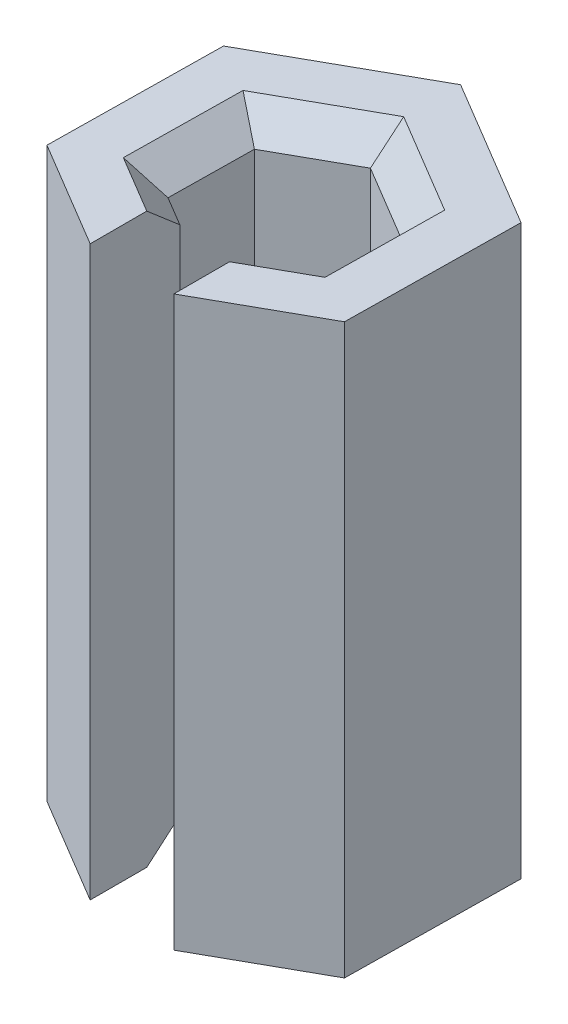
ISO-10303-21;
HEADER;
FILE_DESCRIPTION(('STEP AP214'),'2;1');
FILE_NAME('part.step','',(''),(''),'','','');
FILE_SCHEMA(('AUTOMOTIVE_DESIGN { 1 0 10303 214 1 1 1 1 }'));
ENDSEC;
DATA;
#1=APPLICATION_CONTEXT('core data for automotive mechanical design processes');
#2=APPLICATION_PROTOCOL_DEFINITION('international standard','automotive_design',2000,#1);
#3=PRODUCT_CONTEXT('',#1,'mechanical');
#4=PRODUCT('Part','Part','',(#3));
#5=PRODUCT_RELATED_PRODUCT_CATEGORY('part','',(#4));
#6=PRODUCT_DEFINITION_FORMATION('','',#4);
#7=PRODUCT_DEFINITION_CONTEXT('part definition',#1,'design');
#8=PRODUCT_DEFINITION('design','',#6,#7);
#9=PRODUCT_DEFINITION_SHAPE('','',#8);
#10=(LENGTH_UNIT() NAMED_UNIT(*) SI_UNIT(.MILLI.,.METRE.));
#11=(NAMED_UNIT(*) PLANE_ANGLE_UNIT() SI_UNIT($,.RADIAN.));
#12=(NAMED_UNIT(*) SI_UNIT($,.STERADIAN.) SOLID_ANGLE_UNIT());
#13=UNCERTAINTY_MEASURE_WITH_UNIT(LENGTH_MEASURE(1.E-05),#10,'distance_accuracy_value','');
#14=(GEOMETRIC_REPRESENTATION_CONTEXT(3) GLOBAL_UNCERTAINTY_ASSIGNED_CONTEXT((#13)) GLOBAL_UNIT_ASSIGNED_CONTEXT((#10,
#11,#12)) REPRESENTATION_CONTEXT('',''));
#15=CARTESIAN_POINT('',(0.,0.,0.));
#16=DIRECTION('',(0.,0.,1.));
#17=DIRECTION('',(1.,0.,0.));
#18=AXIS2_PLACEMENT_3D('',#15,#16,#17);
#19=CARTESIAN_POINT('',(0.,20.,0.));
#20=DIRECTION('',(0.,1.,0.));
#21=DIRECTION('',(0.,0.,1.));
#22=AXIS2_PLACEMENT_3D('',#19,#20,#21);
#23=PLANE('',#22);
#24=DIRECTION('',(0.,0.,1.));
#25=VECTOR('',#24,1.);
#26=CARTESIAN_POINT('',(-1.58490770605281,20.,1.65700419467966));
#27=LINE('',#26,#25);
#28=CARTESIAN_POINT('',(-1.58490770605281,20.,3.2440418816604));
#29=VERTEX_POINT('',#28);
#30=CARTESIAN_POINT('',(-1.58490770605281,20.,5.23604892409862));
#31=VERTEX_POINT('',#30);
#32=EDGE_CURVE('E201',#29,#31,#27,.T.);
#33=ORIENTED_EDGE('',*,*,#32,.F.);
#34=DIRECTION('',(-0.85901741654641,0.,-0.511946362493116));
#35=VECTOR('',#34,1.);
#36=CARTESIAN_POINT('',(-1.84202202837534,20.,3.09081013161382));
#37=LINE('',#36,#35);
#38=CARTESIAN_POINT('',(-3.6265020898766,20.,2.0273182176781));
#39=VERTEX_POINT('',#38);
#40=EDGE_CURVE('E257',#29,#39,#37,.T.);
#41=ORIENTED_EDGE('',*,*,#40,.T.);
#42=DIRECTION('',(0.0138498470208704,0.,-0.999904086269027));
#43=VECTOR('',#42,1.);
#44=CARTESIAN_POINT('',(-3.59773110643956,20.,-0.0498328050966762));
#45=LINE('',#44,#43);
#46=CARTESIAN_POINT('',(-3.56896012300252,20.,-2.12698382787145));
#47=VERTEX_POINT('',#46);
#48=EDGE_CURVE('E259',#39,#47,#45,.T.);
#49=ORIENTED_EDGE('',*,*,#48,.T.);
#50=DIRECTION('',(0.87286726356728,0.,-0.487957723775912));
#51=VECTOR('',#50,1.);
#52=CARTESIAN_POINT('',(-1.75570907806422,20.,-3.1406429367105));
#53=LINE('',#52,#51);
#54=CARTESIAN_POINT('',(0.0575419668740808,20.,-4.15430204554954));
#55=VERTEX_POINT('',#54);
#56=EDGE_CURVE('E250',#47,#55,#53,.T.);
#57=ORIENTED_EDGE('',*,*,#56,.T.);
#58=DIRECTION('',(0.859017416546409,0.,0.511946362493116));
#59=VECTOR('',#58,1.);
#60=CARTESIAN_POINT('',(1.84202202837534,20.,-3.09081013161382));
#61=LINE('',#60,#59);
#62=CARTESIAN_POINT('',(3.6265020898766,20.,-2.02731821767809));
#63=VERTEX_POINT('',#62);
#64=EDGE_CURVE('E252',#55,#63,#61,.T.);
#65=ORIENTED_EDGE('',*,*,#64,.T.);
#66=DIRECTION('',(-0.0138498470208705,0.,0.999904086269027));
#67=VECTOR('',#66,1.);
#68=CARTESIAN_POINT('',(3.59773110643956,20.,0.0498328050966768));
#69=LINE('',#68,#67);
#70=CARTESIAN_POINT('',(3.56896012300252,20.,2.12698382787145));
#71=VERTEX_POINT('',#70);
#72=EDGE_CURVE('E254',#63,#71,#69,.T.);
#73=ORIENTED_EDGE('',*,*,#72,.T.);
#74=DIRECTION('',(-0.87286726356728,0.,0.487957723775912));
#75=VECTOR('',#74,1.);
#76=CARTESIAN_POINT('',(1.75570907806422,20.,3.1406429367105));
#77=LINE('',#76,#75);
#78=CARTESIAN_POINT('',(1.41509229394719,20.,3.33105744484356));
#79=VERTEX_POINT('',#78);
#80=EDGE_CURVE('E200',#71,#79,#77,.T.);
#81=ORIENTED_EDGE('',*,*,#80,.T.);
#82=DIRECTION('',(0.,0.,-1.));
#83=VECTOR('',#82,1.);
#84=CARTESIAN_POINT('',(1.41509229394719,20.,1.65700419467966));
#85=LINE('',#84,#83);
#86=CARTESIAN_POINT('',(1.41509229394719,20.,5.29145716970463));
#87=VERTEX_POINT('',#86);
#88=EDGE_CURVE('E184',#87,#79,#85,.T.);
#89=ORIENTED_EDGE('',*,*,#88,.F.);
#90=DIRECTION('',(0.87286726356728,0.,-0.487957723775912));
#91=VECTOR('',#90,1.);
#92=CARTESIAN_POINT('',(-0.0849077060528104,20.,6.12999999999998));
#93=LINE('',#92,#91);
#94=CARTESIAN_POINT('',(5.26628187217219,20.,3.13853223041879));
#95=VERTEX_POINT('',#94);
#96=EDGE_CURVE('E197',#87,#95,#93,.T.);
#97=ORIENTED_EDGE('',*,*,#96,.T.);
#98=DIRECTION('',(0.0138498470208701,0.,-0.999904086269027));
#99=VECTOR('',#98,1.);
#100=CARTESIAN_POINT('',(5.26628187217219,20.,3.13853223041879));
#101=LINE('',#100,#99);
#102=CARTESIAN_POINT('',(5.351189578225,20.,-2.99146776958119));
#103=VERTEX_POINT('',#102);
#104=EDGE_CURVE('E207',#95,#103,#101,.T.);
#105=ORIENTED_EDGE('',*,*,#104,.T.);
#106=DIRECTION('',(-0.859017416546409,0.,-0.511946362493116));
#107=VECTOR('',#106,1.);
#108=CARTESIAN_POINT('',(5.351189578225,20.,-2.99146776958119));
#109=LINE('',#108,#107);
#110=CARTESIAN_POINT('',(0.0849077060528081,20.,-6.12999999999998));
#111=VERTEX_POINT('',#110);
#112=EDGE_CURVE('E232',#103,#111,#109,.T.);
#113=ORIENTED_EDGE('',*,*,#112,.T.);
#114=DIRECTION('',(-0.87286726356728,0.,0.487957723775912));
#115=VECTOR('',#114,1.);
#116=CARTESIAN_POINT('',(0.0849077060528081,20.,-6.12999999999998));
#117=LINE('',#116,#115);
#118=CARTESIAN_POINT('',(-5.26628187217219,20.,-3.13853223041879));
#119=VERTEX_POINT('',#118);
#120=EDGE_CURVE('E388',#111,#119,#117,.T.);
#121=ORIENTED_EDGE('',*,*,#120,.T.);
#122=DIRECTION('',(-0.0138498470208703,0.,0.999904086269027));
#123=VECTOR('',#122,1.);
#124=CARTESIAN_POINT('',(-5.26628187217219,20.,-3.13853223041879));
#125=LINE('',#124,#123);
#126=CARTESIAN_POINT('',(-5.351189578225,20.,2.9914677695812));
#127=VERTEX_POINT('',#126);
#128=EDGE_CURVE('E213',#119,#127,#125,.T.);
#129=ORIENTED_EDGE('',*,*,#128,.T.);
#130=DIRECTION('',(0.85901741654641,0.,0.511946362493116));
#131=VECTOR('',#130,1.);
#132=CARTESIAN_POINT('',(-5.351189578225,20.,2.9914677695812));
#133=LINE('',#132,#131);
#134=EDGE_CURVE('E208',#127,#31,#133,.T.);
#135=ORIENTED_EDGE('',*,*,#134,.T.);
#136=EDGE_LOOP('',(#33,#41,#49,#57,#65,#73,#81,#89,#97,#105,#113,#121,#129,#135));
#137=FACE_BOUND('',#136,.T.);
#138=ADVANCED_FACE('F40',(#137),#23,.T.);
#139=CARTESIAN_POINT('',(0.,0.,0.));
#140=DIRECTION('',(0.,1.,0.));
#141=DIRECTION('',(0.,0.,1.));
#142=AXIS2_PLACEMENT_3D('',#139,#140,#141);
#143=PLANE('',#142);
#144=DIRECTION('',(0.85901741654641,0.,0.511946362493116));
#145=VECTOR('',#144,1.);
#146=CARTESIAN_POINT('',(-0.553495903555727,0.,3.85872967535349));
#147=LINE('',#146,#145);
#148=CARTESIAN_POINT('',(-3.6265020898766,0.,2.0273182176781));
#149=VERTEX_POINT('',#148);
#150=CARTESIAN_POINT('',(-1.58490770605281,0.,3.2440418816604));
#151=VERTEX_POINT('',#150);
#152=EDGE_CURVE('E289',#149,#151,#147,.T.);
#153=ORIENTED_EDGE('',*,*,#152,.T.);
#154=DIRECTION('',(0.,0.,1.));
#155=VECTOR('',#154,1.);
#156=CARTESIAN_POINT('',(-1.58490770605281,0.,0.));
#157=LINE('',#156,#155);
#158=CARTESIAN_POINT('',(-1.58490770605281,0.,5.23604892409862));
#159=VERTEX_POINT('',#158);
#160=EDGE_CURVE('E55',#151,#159,#157,.T.);
#161=ORIENTED_EDGE('',*,*,#160,.T.);
#162=DIRECTION('',(0.85901741654641,0.,0.511946362493116));
#163=VECTOR('',#162,1.);
#164=CARTESIAN_POINT('',(-5.351189578225,0.,2.9914677695812));
#165=LINE('',#164,#163);
#166=CARTESIAN_POINT('',(-5.351189578225,0.,2.9914677695812));
#167=VERTEX_POINT('',#166);
#168=EDGE_CURVE('E225',#167,#159,#165,.T.);
#169=ORIENTED_EDGE('',*,*,#168,.F.);
#170=DIRECTION('',(-0.0138498470208703,0.,0.999904086269027));
#171=VECTOR('',#170,1.);
#172=CARTESIAN_POINT('',(-5.26628187217219,0.,-3.13853223041879));
#173=LINE('',#172,#171);
#174=CARTESIAN_POINT('',(-5.26628187217219,0.,-3.13853223041879));
#175=VERTEX_POINT('',#174);
#176=EDGE_CURVE('E223',#175,#167,#173,.T.);
#177=ORIENTED_EDGE('',*,*,#176,.F.);
#178=DIRECTION('',(-0.87286726356728,0.,0.487957723775912));
#179=VECTOR('',#178,1.);
#180=CARTESIAN_POINT('',(0.0849077060528081,0.,-6.12999999999998));
#181=LINE('',#180,#179);
#182=CARTESIAN_POINT('',(0.0849077060528081,0.,-6.12999999999998));
#183=VERTEX_POINT('',#182);
#184=EDGE_CURVE('E220',#183,#175,#181,.T.);
#185=ORIENTED_EDGE('',*,*,#184,.F.);
#186=DIRECTION('',(-0.859017416546409,0.,-0.511946362493116));
#187=VECTOR('',#186,1.);
#188=CARTESIAN_POINT('',(5.351189578225,0.,-2.99146776958119));
#189=LINE('',#188,#187);
#190=CARTESIAN_POINT('',(5.351189578225,0.,-2.99146776958119));
#191=VERTEX_POINT('',#190);
#192=EDGE_CURVE('E217',#191,#183,#189,.T.);
#193=ORIENTED_EDGE('',*,*,#192,.F.);
#194=DIRECTION('',(0.0138498470208701,0.,-0.999904086269027));
#195=VECTOR('',#194,1.);
#196=CARTESIAN_POINT('',(5.26628187217219,0.,3.13853223041879));
#197=LINE('',#196,#195);
#198=CARTESIAN_POINT('',(5.26628187217219,0.,3.13853223041879));
#199=VERTEX_POINT('',#198);
#200=EDGE_CURVE('E230',#199,#191,#197,.T.);
#201=ORIENTED_EDGE('',*,*,#200,.F.);
#202=DIRECTION('',(0.87286726356728,0.,-0.487957723775912));
#203=VECTOR('',#202,1.);
#204=CARTESIAN_POINT('',(-0.0849077060528104,0.,6.12999999999998));
#205=LINE('',#204,#203);
#206=CARTESIAN_POINT('',(1.41509229394719,0.,5.29145716970463));
#207=VERTEX_POINT('',#206);
#208=EDGE_CURVE('E228',#207,#199,#205,.T.);
#209=ORIENTED_EDGE('',*,*,#208,.F.);
#210=DIRECTION('',(0.,0.,-1.));
#211=VECTOR('',#210,1.);
#212=CARTESIAN_POINT('',(1.41509229394719,0.,0.));
#213=LINE('',#212,#211);
#214=CARTESIAN_POINT('',(1.41509229394719,0.,3.33105744484356));
#215=VERTEX_POINT('',#214);
#216=EDGE_CURVE('E187',#207,#215,#213,.T.);
#217=ORIENTED_EDGE('',*,*,#216,.T.);
#218=DIRECTION('',(0.87286726356728,0.,-0.487957723775912));
#219=VECTOR('',#218,1.);
#220=CARTESIAN_POINT('',(3.06500997341514,0.,2.40870635104663));
#221=LINE('',#220,#219);
#222=CARTESIAN_POINT('',(3.56896012300252,0.,2.12698382787145));
#223=VERTEX_POINT('',#222);
#224=EDGE_CURVE('E287',#215,#223,#221,.T.);
#225=ORIENTED_EDGE('',*,*,#224,.T.);
#226=DIRECTION('',(0.0138498470208705,0.,-0.999904086269027));
#227=VECTOR('',#226,1.);
#228=CARTESIAN_POINT('',(3.61850587697087,0.,-1.45002332430686));
#229=LINE('',#228,#227);
#230=CARTESIAN_POINT('',(3.6265020898766,0.,-2.02731821767809));
#231=VERTEX_POINT('',#230);
#232=EDGE_CURVE('E285',#223,#231,#229,.T.);
#233=ORIENTED_EDGE('',*,*,#232,.T.);
#234=DIRECTION('',(-0.859017416546409,0.,-0.511946362493116));
#235=VECTOR('',#234,1.);
#236=CARTESIAN_POINT('',(0.553495903555729,0.,-3.85872967535349));
#237=LINE('',#236,#235);
#238=CARTESIAN_POINT('',(0.0575419668740807,0.,-4.15430204554954));
#239=VERTEX_POINT('',#238);
#240=EDGE_CURVE('E296',#231,#239,#237,.T.);
#241=ORIENTED_EDGE('',*,*,#240,.T.);
#242=DIRECTION('',(-0.87286726356728,0.,0.487957723775912));
#243=VECTOR('',#242,1.);
#244=CARTESIAN_POINT('',(-3.06500997341514,0.,-2.40870635104663));
#245=LINE('',#244,#243);
#246=CARTESIAN_POINT('',(-3.56896012300252,0.,-2.12698382787145));
#247=VERTEX_POINT('',#246);
#248=EDGE_CURVE('E294',#239,#247,#245,.T.);
#249=ORIENTED_EDGE('',*,*,#248,.T.);
#250=DIRECTION('',(-0.0138498470208704,0.,0.999904086269027));
#251=VECTOR('',#250,1.);
#252=CARTESIAN_POINT('',(-3.61850587697087,0.,1.45002332430686));
#253=LINE('',#252,#251);
#254=EDGE_CURVE('E292',#247,#149,#253,.T.);
#255=ORIENTED_EDGE('',*,*,#254,.T.);
#256=EDGE_LOOP('',(#153,#161,#169,#177,#185,#193,#201,#209,#217,#225,#233,#241,#249,#255));
#257=FACE_BOUND('',#256,.T.);
#258=ADVANCED_FACE('F330',(#257),#143,.F.);
#259=CARTESIAN_POINT('',(5.351189578225,20.,-2.99146776958119));
#260=DIRECTION('',(-0.511946362493116,0.,0.85901741654641));
#261=DIRECTION('',(0.85901741654641,0.,0.511946362493116));
#262=AXIS2_PLACEMENT_3D('',#259,#260,#261);
#263=PLANE('',#262);
#264=ORIENTED_EDGE('',*,*,#192,.T.);
#265=DIRECTION('',(0.,-1.,0.));
#266=VECTOR('',#265,1.);
#267=CARTESIAN_POINT('',(0.0849077060528081,20.,-6.12999999999998));
#268=LINE('',#267,#266);
#269=EDGE_CURVE('E242',#111,#183,#268,.T.);
#270=ORIENTED_EDGE('',*,*,#269,.F.);
#271=ORIENTED_EDGE('',*,*,#112,.F.);
#272=DIRECTION('',(0.,-1.,0.));
#273=VECTOR('',#272,1.);
#274=CARTESIAN_POINT('',(5.351189578225,20.,-2.99146776958119));
#275=LINE('',#274,#273);
#276=EDGE_CURVE('E210',#103,#191,#275,.T.);
#277=ORIENTED_EDGE('',*,*,#276,.T.);
#278=EDGE_LOOP('',(#264,#270,#271,#277));
#279=FACE_BOUND('',#278,.T.);
#280=ADVANCED_FACE('F405',(#279),#263,.F.);
#281=CARTESIAN_POINT('',(0.0849077060528081,20.,-6.12999999999998));
#282=DIRECTION('',(0.487957723775912,0.,0.87286726356728));
#283=DIRECTION('',(0.87286726356728,0.,-0.487957723775912));
#284=AXIS2_PLACEMENT_3D('',#281,#282,#283);
#285=PLANE('',#284);
#286=ORIENTED_EDGE('',*,*,#184,.T.);
#287=DIRECTION('',(0.,-1.,0.));
#288=VECTOR('',#287,1.);
#289=CARTESIAN_POINT('',(-5.26628187217219,20.,-3.13853223041879));
#290=LINE('',#289,#288);
#291=EDGE_CURVE('E239',#119,#175,#290,.T.);
#292=ORIENTED_EDGE('',*,*,#291,.F.);
#293=ORIENTED_EDGE('',*,*,#120,.F.);
#294=ORIENTED_EDGE('',*,*,#269,.T.);
#295=EDGE_LOOP('',(#286,#292,#293,#294));
#296=FACE_BOUND('',#295,.T.);
#297=ADVANCED_FACE('F402',(#296),#285,.F.);
#298=CARTESIAN_POINT('',(-5.26628187217219,20.,-3.13853223041879));
#299=DIRECTION('',(0.999904086269027,0.,0.0138498470208703));
#300=DIRECTION('',(0.0138498470208703,0.,-0.999904086269027));
#301=AXIS2_PLACEMENT_3D('',#298,#299,#300);
#302=PLANE('',#301);
#303=ORIENTED_EDGE('',*,*,#176,.T.);
#304=DIRECTION('',(0.,-1.,0.));
#305=VECTOR('',#304,1.);
#306=CARTESIAN_POINT('',(-5.351189578225,20.,2.9914677695812));
#307=LINE('',#306,#305);
#308=EDGE_CURVE('E236',#127,#167,#307,.T.);
#309=ORIENTED_EDGE('',*,*,#308,.F.);
#310=ORIENTED_EDGE('',*,*,#128,.F.);
#311=ORIENTED_EDGE('',*,*,#291,.T.);
#312=EDGE_LOOP('',(#303,#309,#310,#311));
#313=FACE_BOUND('',#312,.T.);
#314=ADVANCED_FACE('F394',(#313),#302,.F.);
#315=CARTESIAN_POINT('',(-5.351189578225,20.,2.9914677695812));
#316=DIRECTION('',(0.511946362493116,0.,-0.85901741654641));
#317=DIRECTION('',(-0.85901741654641,0.,-0.511946362493116));
#318=AXIS2_PLACEMENT_3D('',#315,#316,#317);
#319=PLANE('',#318);
#320=ORIENTED_EDGE('',*,*,#168,.T.);
#321=DIRECTION('',(0.,1.,0.));
#322=VECTOR('',#321,1.);
#323=CARTESIAN_POINT('',(-1.58490770605281,20.,5.23604892409862));
#324=LINE('',#323,#322);
#325=EDGE_CURVE('E317',#159,#31,#324,.T.);
#326=ORIENTED_EDGE('',*,*,#325,.T.);
#327=ORIENTED_EDGE('',*,*,#134,.F.);
#328=ORIENTED_EDGE('',*,*,#308,.T.);
#329=EDGE_LOOP('',(#320,#326,#327,#328));
#330=FACE_BOUND('',#329,.T.);
#331=ADVANCED_FACE('F398',(#330),#319,.F.);
#332=CARTESIAN_POINT('',(-0.0849077060528104,20.,6.12999999999998));
#333=DIRECTION('',(-0.487957723775912,0.,-0.87286726356728));
#334=DIRECTION('',(-0.87286726356728,0.,0.487957723775912));
#335=AXIS2_PLACEMENT_3D('',#332,#333,#334);
#336=PLANE('',#335);
#337=ORIENTED_EDGE('',*,*,#96,.F.);
#338=DIRECTION('',(0.,-1.,0.));
#339=VECTOR('',#338,1.);
#340=CARTESIAN_POINT('',(1.41509229394719,20.,5.29145716970463));
#341=LINE('',#340,#339);
#342=EDGE_CURVE('E181',#87,#207,#341,.T.);
#343=ORIENTED_EDGE('',*,*,#342,.T.);
#344=ORIENTED_EDGE('',*,*,#208,.T.);
#345=DIRECTION('',(0.,-1.,0.));
#346=VECTOR('',#345,1.);
#347=CARTESIAN_POINT('',(5.26628187217219,20.,3.13853223041879));
#348=LINE('',#347,#346);
#349=EDGE_CURVE('E205',#95,#199,#348,.T.);
#350=ORIENTED_EDGE('',*,*,#349,.F.);
#351=EDGE_LOOP('',(#337,#343,#344,#350));
#352=FACE_BOUND('',#351,.T.);
#353=ADVANCED_FACE('F203',(#352),#336,.F.);
#354=CARTESIAN_POINT('',(5.26628187217219,20.,3.13853223041879));
#355=DIRECTION('',(-0.999904086269027,0.,-0.0138498470208701));
#356=DIRECTION('',(-0.0138498470208701,0.,0.999904086269027));
#357=AXIS2_PLACEMENT_3D('',#354,#355,#356);
#358=PLANE('',#357);
#359=ORIENTED_EDGE('',*,*,#200,.T.);
#360=ORIENTED_EDGE('',*,*,#276,.F.);
#361=ORIENTED_EDGE('',*,*,#104,.F.);
#362=ORIENTED_EDGE('',*,*,#349,.T.);
#363=EDGE_LOOP('',(#359,#360,#361,#362));
#364=FACE_BOUND('',#363,.T.);
#365=ADVANCED_FACE('F408',(#364),#358,.F.);
#366=CARTESIAN_POINT('',(2.61860179070184,20.,-1.46387317132773));
#367=DIRECTION('',(-0.511946362493116,0.,0.859017416546409));
#368=DIRECTION('',(0.859017416546409,0.,0.511946362493116));
#369=AXIS2_PLACEMENT_3D('',#366,#367,#368);
#370=PLANE('',#369);
#371=DIRECTION('',(0.,-1.,0.));
#372=VECTOR('',#371,1.);
#373=CARTESIAN_POINT('',(2.61860179070184,20.,-1.46387317132773));
#374=LINE('',#373,#372);
#375=CARTESIAN_POINT('',(2.61860179070184,19.,-1.46387317132773));
#376=VERTEX_POINT('',#375);
#377=CARTESIAN_POINT('',(2.61860179070184,1.00000000000001,-1.46387317132773));
#378=VERTEX_POINT('',#377);
#379=EDGE_CURVE('E313',#376,#378,#374,.T.);
#380=ORIENTED_EDGE('',*,*,#379,.F.);
#381=DIRECTION('',(-0.859017416546409,0.,-0.511946362493116));
#382=VECTOR('',#381,1.);
#383=CARTESIAN_POINT('',(2.61860179070184,19.,-1.46387317132773));
#384=LINE('',#383,#382);
#385=CARTESIAN_POINT('',(0.0415495410626116,19.,-2.99971225880708));
#386=VERTEX_POINT('',#385);
#387=EDGE_CURVE('E279',#376,#386,#384,.T.);
#388=ORIENTED_EDGE('',*,*,#387,.T.);
#389=DIRECTION('',(0.,-1.,0.));
#390=VECTOR('',#389,1.);
#391=CARTESIAN_POINT('',(0.0415495410626116,20.,-2.99971225880708));
#392=LINE('',#391,#390);
#393=CARTESIAN_POINT('',(0.0415495410626116,1.00000000000001,-2.99971225880708));
#394=VERTEX_POINT('',#393);
#395=EDGE_CURVE('E221',#386,#394,#392,.T.);
#396=ORIENTED_EDGE('',*,*,#395,.T.);
#397=DIRECTION('',(0.859017416546409,0.,0.511946362493116));
#398=VECTOR('',#397,1.);
#399=CARTESIAN_POINT('',(2.61860179070184,1.00000000000001,-1.46387317132773));
#400=LINE('',#399,#398);
#401=EDGE_CURVE('E276',#394,#378,#400,.T.);
#402=ORIENTED_EDGE('',*,*,#401,.T.);
#403=EDGE_LOOP('',(#380,#388,#396,#402));
#404=FACE_BOUND('',#403,.T.);
#405=ADVANCED_FACE('F410',(#404),#370,.T.);
#406=CARTESIAN_POINT('',(0.0415495410626116,20.,-2.99971225880708));
#407=DIRECTION('',(0.487957723775912,0.,0.87286726356728));
#408=DIRECTION('',(0.87286726356728,0.,-0.487957723775912));
#409=AXIS2_PLACEMENT_3D('',#406,#407,#408);
#410=PLANE('',#409);
#411=ORIENTED_EDGE('',*,*,#395,.F.);
#412=DIRECTION('',(-0.87286726356728,0.,0.487957723775912));
#413=VECTOR('',#412,1.);
#414=CARTESIAN_POINT('',(0.0415495410626116,19.,-2.99971225880708));
#415=LINE('',#414,#413);
#416=CARTESIAN_POINT('',(-2.57705224963923,19.,-1.53583908747935));
#417=VERTEX_POINT('',#416);
#418=EDGE_CURVE('E283',#386,#417,#415,.T.);
#419=ORIENTED_EDGE('',*,*,#418,.T.);
#420=DIRECTION('',(0.,-1.,0.));
#421=VECTOR('',#420,1.);
#422=CARTESIAN_POINT('',(-2.57705224963923,20.,-1.53583908747935));
#423=LINE('',#422,#421);
#424=CARTESIAN_POINT('',(-2.57705224963923,1.00000000000001,-1.53583908747935));
#425=VERTEX_POINT('',#424);
#426=EDGE_CURVE('E381',#417,#425,#423,.T.);
#427=ORIENTED_EDGE('',*,*,#426,.T.);
#428=DIRECTION('',(0.87286726356728,0.,-0.487957723775912));
#429=VECTOR('',#428,1.);
#430=CARTESIAN_POINT('',(0.0415495410626116,1.00000000000001,-2.99971225880708));
#431=LINE('',#430,#429);
#432=EDGE_CURVE('E281',#425,#394,#431,.T.);
#433=ORIENTED_EDGE('',*,*,#432,.T.);
#434=EDGE_LOOP('',(#411,#419,#427,#433));
#435=FACE_BOUND('',#434,.T.);
#436=ADVANCED_FACE('F416',(#435),#410,.T.);
#437=CARTESIAN_POINT('',(-2.57705224963923,20.,-1.53583908747935));
#438=DIRECTION('',(0.999904086269027,0.,0.0138498470208703));
#439=DIRECTION('',(0.0138498470208703,0.,-0.999904086269027));
#440=AXIS2_PLACEMENT_3D('',#437,#438,#439);
#441=PLANE('',#440);
#442=ORIENTED_EDGE('',*,*,#426,.F.);
#443=DIRECTION('',(-0.0138498470208703,0.,0.999904086269027));
#444=VECTOR('',#443,1.);
#445=CARTESIAN_POINT('',(-2.57705224963923,19.,-1.53583908747935));
#446=LINE('',#445,#444);
#447=CARTESIAN_POINT('',(-2.61860179070184,19.,1.46387317132773));
#448=VERTEX_POINT('',#447);
#449=EDGE_CURVE('E247',#417,#448,#446,.T.);
#450=ORIENTED_EDGE('',*,*,#449,.T.);
#451=DIRECTION('',(0.,-1.,0.));
#452=VECTOR('',#451,1.);
#453=CARTESIAN_POINT('',(-2.61860179070184,20.,1.46387317132773));
#454=LINE('',#453,#452);
#455=CARTESIAN_POINT('',(-2.61860179070184,1.00000000000001,1.46387317132773));
#456=VERTEX_POINT('',#455);
#457=EDGE_CURVE('E379',#448,#456,#454,.T.);
#458=ORIENTED_EDGE('',*,*,#457,.T.);
#459=DIRECTION('',(0.0138498470208703,0.,-0.999904086269027));
#460=VECTOR('',#459,1.);
#461=CARTESIAN_POINT('',(-2.57705224963923,1.00000000000001,-1.53583908747935));
#462=LINE('',#461,#460);
#463=EDGE_CURVE('E245',#456,#425,#462,.T.);
#464=ORIENTED_EDGE('',*,*,#463,.T.);
#465=EDGE_LOOP('',(#442,#450,#458,#464));
#466=FACE_BOUND('',#465,.T.);
#467=ADVANCED_FACE('F431',(#466),#441,.T.);
#468=CARTESIAN_POINT('',(-2.61860179070184,20.,1.46387317132773));
#469=DIRECTION('',(0.511946362493116,0.,-0.85901741654641));
#470=DIRECTION('',(-0.85901741654641,0.,-0.511946362493116));
#471=AXIS2_PLACEMENT_3D('',#468,#469,#470);
#472=PLANE('',#471);
#473=DIRECTION('',(0.,1.,0.));
#474=VECTOR('',#473,1.);
#475=CARTESIAN_POINT('',(-1.58490770605281,20.,2.07992113074432));
#476=LINE('',#475,#474);
#477=CARTESIAN_POINT('',(-1.58490770605281,1.00000000000001,2.07992113074432));
#478=VERTEX_POINT('',#477);
#479=CARTESIAN_POINT('',(-1.58490770605281,19.,2.07992113074432));
#480=VERTEX_POINT('',#479);
#481=EDGE_CURVE('E191',#478,#480,#476,.T.);
#482=ORIENTED_EDGE('',*,*,#481,.F.);
#483=DIRECTION('',(-0.85901741654641,0.,-0.511946362493116));
#484=VECTOR('',#483,1.);
#485=CARTESIAN_POINT('',(-2.61860179070184,1.00000000000001,1.46387317132773));
#486=LINE('',#485,#484);
#487=EDGE_CURVE('E262',#478,#456,#486,.T.);
#488=ORIENTED_EDGE('',*,*,#487,.T.);
#489=ORIENTED_EDGE('',*,*,#457,.F.);
#490=DIRECTION('',(0.85901741654641,0.,0.511946362493116));
#491=VECTOR('',#490,1.);
#492=CARTESIAN_POINT('',(-2.61860179070184,19.,1.46387317132773));
#493=LINE('',#492,#491);
#494=EDGE_CURVE('E264',#448,#480,#493,.T.);
#495=ORIENTED_EDGE('',*,*,#494,.T.);
#496=EDGE_LOOP('',(#482,#488,#489,#495));
#497=FACE_BOUND('',#496,.T.);
#498=ADVANCED_FACE('F362',(#497),#472,.T.);
#499=CARTESIAN_POINT('',(-0.04154954106261,20.,2.99971225880708));
#500=DIRECTION('',(-0.487957723775912,0.,-0.87286726356728));
#501=DIRECTION('',(-0.87286726356728,0.,0.487957723775912));
#502=AXIS2_PLACEMENT_3D('',#499,#500,#501);
#503=PLANE('',#502);
#504=DIRECTION('',(0.,-1.,0.));
#505=VECTOR('',#504,1.);
#506=CARTESIAN_POINT('',(1.41509229394719,20.,2.18540788076992));
#507=LINE('',#506,#505);
#508=CARTESIAN_POINT('',(1.41509229394719,19.,2.18540788076992));
#509=VERTEX_POINT('',#508);
#510=CARTESIAN_POINT('',(1.41509229394719,1.00000000000001,2.18540788076992));
#511=VERTEX_POINT('',#510);
#512=EDGE_CURVE('E63',#509,#511,#507,.T.);
#513=ORIENTED_EDGE('',*,*,#512,.F.);
#514=DIRECTION('',(0.87286726356728,0.,-0.487957723775912));
#515=VECTOR('',#514,1.);
#516=CARTESIAN_POINT('',(-0.04154954106261,19.,2.99971225880708));
#517=LINE('',#516,#515);
#518=CARTESIAN_POINT('',(2.57705224963923,19.,1.53583908747935));
#519=VERTEX_POINT('',#518);
#520=EDGE_CURVE('E270',#509,#519,#517,.T.);
#521=ORIENTED_EDGE('',*,*,#520,.T.);
#522=DIRECTION('',(0.,-1.,0.));
#523=VECTOR('',#522,1.);
#524=CARTESIAN_POINT('',(2.57705224963923,20.,1.53583908747935));
#525=LINE('',#524,#523);
#526=CARTESIAN_POINT('',(2.57705224963923,1.00000000000001,1.53583908747935));
#527=VERTEX_POINT('',#526);
#528=EDGE_CURVE('E376',#519,#527,#525,.T.);
#529=ORIENTED_EDGE('',*,*,#528,.T.);
#530=DIRECTION('',(-0.87286726356728,0.,0.487957723775912));
#531=VECTOR('',#530,1.);
#532=CARTESIAN_POINT('',(-0.0415495410626099,1.00000000000001,2.99971225880708));
#533=LINE('',#532,#531);
#534=EDGE_CURVE('E267',#527,#511,#533,.T.);
#535=ORIENTED_EDGE('',*,*,#534,.T.);
#536=EDGE_LOOP('',(#513,#521,#529,#535));
#537=FACE_BOUND('',#536,.T.);
#538=ADVANCED_FACE('F438',(#537),#503,.T.);
#539=CARTESIAN_POINT('',(2.57705224963923,20.,1.53583908747935));
#540=DIRECTION('',(-0.999904086269027,0.,-0.0138498470208705));
#541=DIRECTION('',(-0.0138498470208705,0.,0.999904086269027));
#542=AXIS2_PLACEMENT_3D('',#539,#540,#541);
#543=PLANE('',#542);
#544=ORIENTED_EDGE('',*,*,#528,.F.);
#545=DIRECTION('',(0.0138498470208705,0.,-0.999904086269027));
#546=VECTOR('',#545,1.);
#547=CARTESIAN_POINT('',(2.57705224963923,19.,1.53583908747935));
#548=LINE('',#547,#546);
#549=EDGE_CURVE('E274',#519,#376,#548,.T.);
#550=ORIENTED_EDGE('',*,*,#549,.T.);
#551=ORIENTED_EDGE('',*,*,#379,.T.);
#552=DIRECTION('',(-0.0138498470208705,0.,0.999904086269027));
#553=VECTOR('',#552,1.);
#554=CARTESIAN_POINT('',(2.57705224963923,1.00000000000001,1.53583908747935));
#555=LINE('',#554,#553);
#556=EDGE_CURVE('E272',#378,#527,#555,.T.);
#557=ORIENTED_EDGE('',*,*,#556,.T.);
#558=EDGE_LOOP('',(#544,#550,#551,#557));
#559=FACE_BOUND('',#558,.T.);
#560=ADVANCED_FACE('F441',(#559),#543,.T.);
#561=CARTESIAN_POINT('',(2.57705224963923,19.,1.53583908747935));
#562=DIRECTION('',(0.707038959936966,-0.707106781186549,0.0097933207468538));
#563=DIRECTION('',(0.0138498470208705,0.,-0.999904086269027));
#564=AXIS2_PLACEMENT_3D('',#561,#562,#563);
#565=PLANE('',#564);
#566=DIRECTION('',(0.649356130301424,0.654653670707975,0.386995074217403));
#567=VECTOR('',#566,1.);
#568=CARTESIAN_POINT('',(1.84075160688516,18.2576925110419,1.0970279196281));
#569=LINE('',#568,#567);
#570=EDGE_CURVE('E307',#71,#519,#569,.F.);
#571=ORIENTED_EDGE('',*,*,#570,.F.);
#572=ORIENTED_EDGE('',*,*,#72,.F.);
#573=DIRECTION('',(0.659825630562428,0.654653670707975,-0.368861367835489));
#574=VECTOR('',#573,1.);
#575=CARTESIAN_POINT('',(1.87042985050131,18.2576925110419,-1.04562369380552));
#576=LINE('',#575,#574);
#577=EDGE_CURVE('E310',#376,#63,#576,.T.);
#578=ORIENTED_EDGE('',*,*,#577,.F.);
#579=ORIENTED_EDGE('',*,*,#549,.F.);
#580=EDGE_LOOP('',(#571,#572,#578,#579));
#581=FACE_BOUND('',#580,.T.);
#582=ADVANCED_FACE('F445',(#581),#565,.F.);
#583=CARTESIAN_POINT('',(2.61860179070184,19.,-1.46387317132773));
#584=DIRECTION('',(0.362000744522668,-0.707106781186549,-0.607417040397314));
#585=DIRECTION('',(-0.859017416546409,0.,-0.511946362493116));
#586=AXIS2_PLACEMENT_3D('',#583,#584,#585);
#587=PLANE('',#586);
#588=ORIENTED_EDGE('',*,*,#577,.T.);
#589=ORIENTED_EDGE('',*,*,#64,.F.);
#590=DIRECTION('',(0.0104695002610032,0.654653670707975,-0.755856442052893));
#591=VECTOR('',#590,1.);
#592=CARTESIAN_POINT('',(0.0296782436161511,18.2576925110419,-2.14265161343363));
#593=LINE('',#592,#591);
#594=EDGE_CURVE('E304',#386,#55,#593,.T.);
#595=ORIENTED_EDGE('',*,*,#594,.F.);
#596=ORIENTED_EDGE('',*,*,#387,.F.);
#597=EDGE_LOOP('',(#588,#589,#595,#596));
#598=FACE_BOUND('',#597,.T.);
#599=ADVANCED_FACE('F520',(#598),#587,.F.);
#600=CARTESIAN_POINT('',(-0.04154954106261,19.,2.99971225880708));
#601=DIRECTION('',(0.345038215414299,-0.707106781186549,0.617210361144167));
#602=DIRECTION('',(0.87286726356728,0.,-0.487957723775912));
#603=AXIS2_PLACEMENT_3D('',#600,#601,#602);
#604=PLANE('',#603);
#605=DIRECTION('',(0.,0.657594111705269,0.753372407412534));
#606=VECTOR('',#605,1.);
#607=CARTESIAN_POINT('',(1.41509229394719,19.4034171857704,2.64758260378763));
#608=LINE('',#607,#606);
#609=EDGE_CURVE('E192',#79,#509,#608,.F.);
#610=ORIENTED_EDGE('',*,*,#609,.F.);
#611=ORIENTED_EDGE('',*,*,#80,.F.);
#612=ORIENTED_EDGE('',*,*,#570,.T.);
#613=ORIENTED_EDGE('',*,*,#520,.F.);
#614=EDGE_LOOP('',(#610,#611,#612,#613));
#615=FACE_BOUND('',#614,.T.);
#616=ADVANCED_FACE('F514',(#615),#604,.F.);
#617=CARTESIAN_POINT('',(0.0415495410626116,19.,-2.99971225880708));
#618=DIRECTION('',(-0.345038215414299,-0.707106781186549,-0.617210361144167));
#619=DIRECTION('',(-0.87286726356728,0.,0.487957723775912));
#620=AXIS2_PLACEMENT_3D('',#617,#618,#619);
#621=PLANE('',#620);
#622=ORIENTED_EDGE('',*,*,#594,.T.);
#623=ORIENTED_EDGE('',*,*,#56,.F.);
#624=DIRECTION('',(0.649356130301424,-0.654653670707975,0.386995074217404));
#625=VECTOR('',#624,1.);
#626=CARTESIAN_POINT('',(-2.57705224963923,19.,-1.53583908747935));
#627=LINE('',#626,#625);
#628=EDGE_CURVE('E301',#417,#47,#627,.F.);
#629=ORIENTED_EDGE('',*,*,#628,.F.);
#630=ORIENTED_EDGE('',*,*,#418,.F.);
#631=EDGE_LOOP('',(#622,#623,#629,#630));
#632=FACE_BOUND('',#631,.T.);
#633=ADVANCED_FACE('F496',(#632),#621,.F.);
#634=CARTESIAN_POINT('',(-2.61860179070184,19.,1.46387317132773));
#635=DIRECTION('',(-0.362000744522667,-0.70710678118655,0.607417040397313));
#636=DIRECTION('',(0.85901741654641,0.,0.511946362493116));
#637=AXIS2_PLACEMENT_3D('',#634,#635,#636);
#638=PLANE('',#637);
#639=DIRECTION('',(0.,-0.651610708653458,-0.758553547462629));
#640=VECTOR('',#639,1.);
#641=CARTESIAN_POINT('',(-1.58490770605281,18.6954988199401,1.72544498835813));
#642=LINE('',#641,#640);
#643=EDGE_CURVE('E367',#480,#29,#642,.F.);
#644=ORIENTED_EDGE('',*,*,#643,.F.);
#645=ORIENTED_EDGE('',*,*,#494,.F.);
#646=DIRECTION('',(-0.659825630562427,0.654653670707975,0.368861367835491));
#647=VECTOR('',#646,1.);
#648=CARTESIAN_POINT('',(-1.87042985050131,18.2576925110419,1.04562369380552));
#649=LINE('',#648,#647);
#650=EDGE_CURVE('E299',#39,#448,#649,.F.);
#651=ORIENTED_EDGE('',*,*,#650,.F.);
#652=ORIENTED_EDGE('',*,*,#40,.F.);
#653=EDGE_LOOP('',(#644,#645,#651,#652));
#654=FACE_BOUND('',#653,.T.);
#655=ADVANCED_FACE('F490',(#654),#638,.F.);
#656=CARTESIAN_POINT('',(-2.57705224963923,19.,-1.53583908747935));
#657=DIRECTION('',(-0.707038959936966,-0.707106781186549,-0.00979332074685371));
#658=DIRECTION('',(-0.0138498470208703,0.,0.999904086269027));
#659=AXIS2_PLACEMENT_3D('',#656,#657,#658);
#660=PLANE('',#659);
#661=ORIENTED_EDGE('',*,*,#628,.T.);
#662=ORIENTED_EDGE('',*,*,#48,.F.);
#663=ORIENTED_EDGE('',*,*,#650,.T.);
#664=ORIENTED_EDGE('',*,*,#449,.F.);
#665=EDGE_LOOP('',(#661,#662,#663,#664));
#666=FACE_BOUND('',#665,.T.);
#667=ADVANCED_FACE('F485',(#666),#660,.F.);
#668=CARTESIAN_POINT('',(-1.84202202837534,0.,3.09081013161382));
#669=DIRECTION('',(0.362000744522669,-0.707106781186546,-0.607417040397317));
#670=DIRECTION('',(-0.85901741654641,0.,-0.511946362493116));
#671=AXIS2_PLACEMENT_3D('',#668,#669,#670);
#672=PLANE('',#671);
#673=DIRECTION('',(0.,0.651610708653462,-0.758553547462625));
#674=VECTOR('',#673,1.);
#675=CARTESIAN_POINT('',(-1.58490770605281,0.0757396368231113,3.15587179876777));
#676=LINE('',#675,#674);
#677=EDGE_CURVE('E11',#151,#478,#676,.T.);
#678=ORIENTED_EDGE('',*,*,#677,.F.);
#679=ORIENTED_EDGE('',*,*,#152,.F.);
#680=DIRECTION('',(0.659825630562424,0.654653670707979,-0.368861367835489));
#681=VECTOR('',#680,1.);
#682=CARTESIAN_POINT('',(-3.10843036275137,0.514010887336189,1.73770132943837));
#683=LINE('',#682,#681);
#684=EDGE_CURVE('E302',#456,#149,#683,.F.);
#685=ORIENTED_EDGE('',*,*,#684,.F.);
#686=ORIENTED_EDGE('',*,*,#487,.F.);
#687=EDGE_LOOP('',(#678,#679,#685,#686));
#688=FACE_BOUND('',#687,.T.);
#689=ADVANCED_FACE('F43',(#688),#672,.T.);
#690=CARTESIAN_POINT('',(1.75570907806422,0.,3.1406429367105));
#691=DIRECTION('',(-0.3450382154143,-0.707106781186546,-0.617210361144171));
#692=DIRECTION('',(-0.87286726356728,0.,0.487957723775912));
#693=AXIS2_PLACEMENT_3D('',#690,#691,#692);
#694=PLANE('',#693);
#695=DIRECTION('',(0.,-0.657594111705273,0.753372407412531));
#696=VECTOR('',#695,1.);
#697=CARTESIAN_POINT('',(1.41509229394719,0.0943338720418829,3.2229838854614));
#698=LINE('',#697,#696);
#699=EDGE_CURVE('E49',#511,#215,#698,.T.);
#700=ORIENTED_EDGE('',*,*,#699,.F.);
#701=ORIENTED_EDGE('',*,*,#534,.F.);
#702=DIRECTION('',(-0.649356130301421,0.654653670707979,-0.386995074217401));
#703=VECTOR('',#702,1.);
#704=CARTESIAN_POINT('',(3.05910867685931,0.514010887336188,1.82312899531839));
#705=LINE('',#704,#703);
#706=EDGE_CURVE('E322',#223,#527,#705,.T.);
#707=ORIENTED_EDGE('',*,*,#706,.F.);
#708=ORIENTED_EDGE('',*,*,#224,.F.);
#709=EDGE_LOOP('',(#700,#701,#707,#708));
#710=FACE_BOUND('',#709,.T.);
#711=ADVANCED_FACE('F334',(#710),#694,.T.);
#712=CARTESIAN_POINT('',(-3.59773110643956,0.,-0.0498328050966762));
#713=DIRECTION('',(0.70703895993697,-0.707106781186545,0.00979332074685376));
#714=DIRECTION('',(0.0138498470208703,0.,-0.999904086269027));
#715=AXIS2_PLACEMENT_3D('',#712,#713,#714);
#716=PLANE('',#715);
#717=ORIENTED_EDGE('',*,*,#684,.T.);
#718=ORIENTED_EDGE('',*,*,#254,.F.);
#719=DIRECTION('',(0.649356130301421,0.654653670707979,0.386995074217402));
#720=VECTOR('',#719,1.);
#721=CARTESIAN_POINT('',(-3.05910867685931,0.514010887336188,-1.82312899531839));
#722=LINE('',#721,#720);
#723=EDGE_CURVE('E319',#425,#247,#722,.F.);
#724=ORIENTED_EDGE('',*,*,#723,.F.);
#725=ORIENTED_EDGE('',*,*,#463,.F.);
#726=EDGE_LOOP('',(#717,#718,#724,#725));
#727=FACE_BOUND('',#726,.T.);
#728=ADVANCED_FACE('F353',(#727),#716,.T.);
#729=CARTESIAN_POINT('',(3.59773110643956,0.,0.0498328050966767));
#730=DIRECTION('',(-0.70703895993697,-0.707106781186546,-0.00979332074685386));
#731=DIRECTION('',(-0.0138498470208705,0.,0.999904086269027));
#732=AXIS2_PLACEMENT_3D('',#729,#730,#731);
#733=PLANE('',#732);
#734=ORIENTED_EDGE('',*,*,#706,.T.);
#735=ORIENTED_EDGE('',*,*,#556,.F.);
#736=DIRECTION('',(0.659825630562425,-0.654653670707979,-0.368861367835488));
#737=VECTOR('',#736,1.);
#738=CARTESIAN_POINT('',(3.10843036275138,0.514010887336189,-1.73770132943837));
#739=LINE('',#738,#737);
#740=EDGE_CURVE('E316',#231,#378,#739,.F.);
#741=ORIENTED_EDGE('',*,*,#740,.F.);
#742=ORIENTED_EDGE('',*,*,#232,.F.);
#743=EDGE_LOOP('',(#734,#735,#741,#742));
#744=FACE_BOUND('',#743,.T.);
#745=ADVANCED_FACE('F339',(#744),#733,.T.);
#746=CARTESIAN_POINT('',(-1.75570907806422,0.,-3.1406429367105));
#747=DIRECTION('',(0.3450382154143,-0.707106781186545,0.617210361144171));
#748=DIRECTION('',(0.87286726356728,0.,-0.487957723775912));
#749=AXIS2_PLACEMENT_3D('',#746,#747,#748);
#750=PLANE('',#749);
#751=ORIENTED_EDGE('',*,*,#723,.T.);
#752=ORIENTED_EDGE('',*,*,#248,.F.);
#753=DIRECTION('',(-0.0104695002610031,0.654653670707979,0.75585644205289));
#754=VECTOR('',#753,1.);
#755=CARTESIAN_POINT('',(0.0493216858920694,0.51401088733619,-3.56083032475675));
#756=LINE('',#755,#754);
#757=EDGE_CURVE('E314',#394,#239,#756,.F.);
#758=ORIENTED_EDGE('',*,*,#757,.F.);
#759=ORIENTED_EDGE('',*,*,#432,.F.);
#760=EDGE_LOOP('',(#751,#752,#758,#759));
#761=FACE_BOUND('',#760,.T.);
#762=ADVANCED_FACE('F349',(#761),#750,.T.);
#763=CARTESIAN_POINT('',(1.84202202837534,0.,-3.09081013161382));
#764=DIRECTION('',(-0.36200074452267,-0.707106781186545,0.607417040397317));
#765=DIRECTION('',(0.859017416546409,0.,0.511946362493116));
#766=AXIS2_PLACEMENT_3D('',#763,#764,#765);
#767=PLANE('',#766);
#768=ORIENTED_EDGE('',*,*,#740,.T.);
#769=ORIENTED_EDGE('',*,*,#401,.F.);
#770=ORIENTED_EDGE('',*,*,#757,.T.);
#771=ORIENTED_EDGE('',*,*,#240,.F.);
#772=EDGE_LOOP('',(#768,#769,#770,#771));
#773=FACE_BOUND('',#772,.T.);
#774=ADVANCED_FACE('F344',(#773),#767,.T.);
#775=CARTESIAN_POINT('',(1.41509229394719,-6.00000000000001,1.65700419467966));
#776=DIRECTION('',(1.,0.,0.));
#777=DIRECTION('',(0.,0.,-1.));
#778=AXIS2_PLACEMENT_3D('',#775,#776,#777);
#779=PLANE('',#778);
#780=ORIENTED_EDGE('',*,*,#88,.T.);
#781=ORIENTED_EDGE('',*,*,#609,.T.);
#782=ORIENTED_EDGE('',*,*,#512,.T.);
#783=ORIENTED_EDGE('',*,*,#699,.T.);
#784=ORIENTED_EDGE('',*,*,#216,.F.);
#785=ORIENTED_EDGE('',*,*,#342,.F.);
#786=EDGE_LOOP('',(#780,#781,#782,#783,#784,#785));
#787=FACE_BOUND('',#786,.T.);
#788=ADVANCED_FACE('F183',(#787),#779,.F.);
#789=CARTESIAN_POINT('',(-1.58490770605281,-6.00000000000001,1.65700419467966));
#790=DIRECTION('',(-1.,0.,0.));
#791=DIRECTION('',(0.,0.,1.));
#792=AXIS2_PLACEMENT_3D('',#789,#790,#791);
#793=PLANE('',#792);
#794=ORIENTED_EDGE('',*,*,#160,.F.);
#795=ORIENTED_EDGE('',*,*,#677,.T.);
#796=ORIENTED_EDGE('',*,*,#481,.T.);
#797=ORIENTED_EDGE('',*,*,#643,.T.);
#798=ORIENTED_EDGE('',*,*,#32,.T.);
#799=ORIENTED_EDGE('',*,*,#325,.F.);
#800=EDGE_LOOP('',(#794,#795,#796,#797,#798,#799));
#801=FACE_BOUND('',#800,.T.);
#802=ADVANCED_FACE('F359',(#801),#793,.F.);
#803=CLOSED_SHELL('',(#138,#258,#280,#297,#314,#331,#353,#365,#405,#436,#467,#498,#538,#560,
#582,#599,#616,#633,#655,#667,#689,#711,#728,#745,#762,#774,#788,#802));
#804=MANIFOLD_SOLID_BREP('B2',#803);
#805=ADVANCED_BREP_SHAPE_REPRESENTATION('',(#18,#804),#14);
#806=SHAPE_DEFINITION_REPRESENTATION(#9,#805);
ENDSEC;
END-ISO-10303-21;
